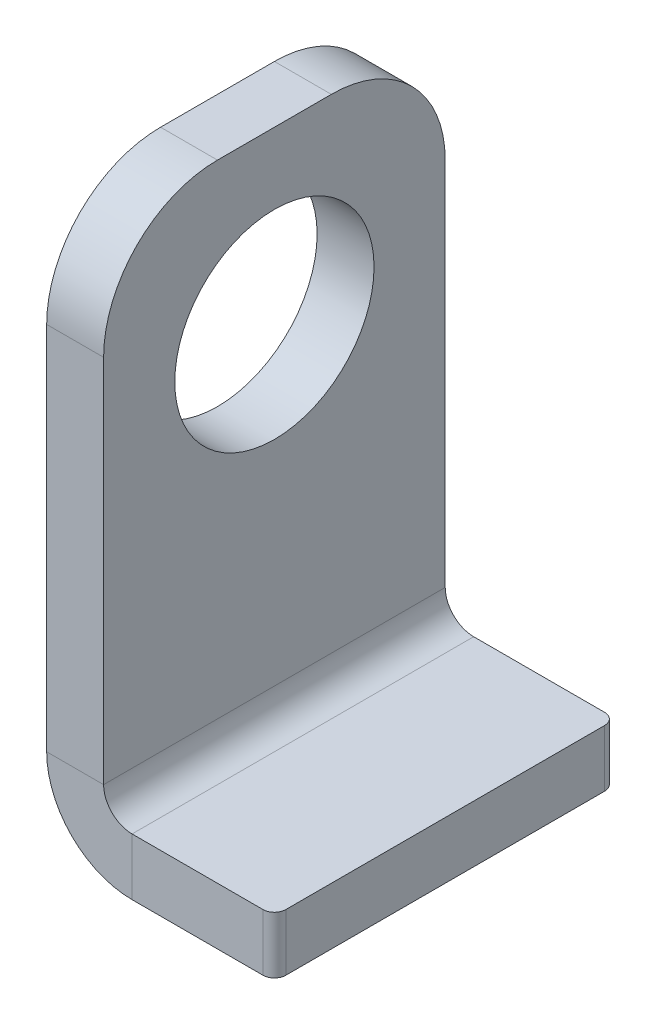
ISO-10303-21;
HEADER;
FILE_DESCRIPTION(('STEP AP214'),'2;1');
FILE_NAME('part.step','',(''),(''),'','','');
FILE_SCHEMA(('AUTOMOTIVE_DESIGN { 1 0 10303 214 1 1 1 1 }'));
ENDSEC;
DATA;
#1=APPLICATION_CONTEXT('core data for automotive mechanical design processes');
#2=APPLICATION_PROTOCOL_DEFINITION('international standard','automotive_design',2000,#1);
#3=PRODUCT_CONTEXT('',#1,'mechanical');
#4=PRODUCT('Part','Part','',(#3));
#5=PRODUCT_RELATED_PRODUCT_CATEGORY('part','',(#4));
#6=PRODUCT_DEFINITION_FORMATION('','',#4);
#7=PRODUCT_DEFINITION_CONTEXT('part definition',#1,'design');
#8=PRODUCT_DEFINITION('design','',#6,#7);
#9=PRODUCT_DEFINITION_SHAPE('','',#8);
#10=(LENGTH_UNIT() NAMED_UNIT(*) SI_UNIT(.MILLI.,.METRE.));
#11=(NAMED_UNIT(*) PLANE_ANGLE_UNIT() SI_UNIT($,.RADIAN.));
#12=(NAMED_UNIT(*) SI_UNIT($,.STERADIAN.) SOLID_ANGLE_UNIT());
#13=UNCERTAINTY_MEASURE_WITH_UNIT(LENGTH_MEASURE(1.E-05),#10,'distance_accuracy_value','');
#14=(GEOMETRIC_REPRESENTATION_CONTEXT(3) GLOBAL_UNCERTAINTY_ASSIGNED_CONTEXT((#13)) GLOBAL_UNIT_ASSIGNED_CONTEXT((#10,
#11,#12)) REPRESENTATION_CONTEXT('',''));
#15=CARTESIAN_POINT('',(0.,0.,0.));
#16=DIRECTION('',(0.,0.,1.));
#17=DIRECTION('',(1.,0.,0.));
#18=AXIS2_PLACEMENT_3D('',#15,#16,#17);
#19=CARTESIAN_POINT('',(0.,-85.,60.));
#20=DIRECTION('',(0.,0.,1.));
#21=DIRECTION('',(1.,0.,0.));
#22=AXIS2_PLACEMENT_3D('',#19,#20,#21);
#23=PLANE('',#22);
#24=DIRECTION('',(1.,0.,0.));
#25=VECTOR('',#24,1.);
#26=CARTESIAN_POINT('',(0.,-85.,60.));
#27=LINE('',#26,#25);
#28=CARTESIAN_POINT('',(0.,-85.,60.));
#29=VERTEX_POINT('',#28);
#30=CARTESIAN_POINT('',(10.,-85.,60.));
#31=VERTEX_POINT('',#30);
#32=EDGE_CURVE('E147',#29,#31,#27,.T.);
#33=ORIENTED_EDGE('',*,*,#32,.F.);
#34=CARTESIAN_POINT('',(15.,-85.,60.));
#35=DIRECTION('',(0.,0.,-1.));
#36=DIRECTION('',(-1.,0.,0.));
#37=AXIS2_PLACEMENT_3D('',#34,#35,#36);
#38=CIRCLE('',#37,15.);
#39=CARTESIAN_POINT('',(15.,-100.,60.));
#40=VERTEX_POINT('',#39);
#41=EDGE_CURVE('E144',#29,#40,#38,.F.);
#42=ORIENTED_EDGE('',*,*,#41,.T.);
#43=DIRECTION('',(0.,-1.,0.));
#44=VECTOR('',#43,1.);
#45=CARTESIAN_POINT('',(15.,-90.,60.));
#46=LINE('',#45,#44);
#47=CARTESIAN_POINT('',(15.,-90.,60.));
#48=VERTEX_POINT('',#47);
#49=EDGE_CURVE('E138',#48,#40,#46,.T.);
#50=ORIENTED_EDGE('',*,*,#49,.F.);
#51=CARTESIAN_POINT('',(15.,-85.,60.));
#52=DIRECTION('',(0.,0.,1.));
#53=DIRECTION('',(1.,0.,0.));
#54=AXIS2_PLACEMENT_3D('',#51,#52,#53);
#55=CIRCLE('',#54,5.);
#56=EDGE_CURVE('E142',#31,#48,#55,.T.);
#57=ORIENTED_EDGE('',*,*,#56,.F.);
#58=EDGE_LOOP('',(#33,#42,#50,#57));
#59=FACE_BOUND('',#58,.T.);
#60=ADVANCED_FACE('F44',(#59),#23,.T.);
#61=CARTESIAN_POINT('',(15.,-90.,60.));
#62=DIRECTION('',(0.,0.,1.));
#63=DIRECTION('',(1.,0.,0.));
#64=AXIS2_PLACEMENT_3D('',#61,#62,#63);
#65=PLANE('',#64);
#66=DIRECTION('',(0.,-1.,0.));
#67=VECTOR('',#66,1.);
#68=CARTESIAN_POINT('',(10.,0.,60.));
#69=LINE('',#68,#67);
#70=CARTESIAN_POINT('',(10.,-20.,60.));
#71=VERTEX_POINT('',#70);
#72=EDGE_CURVE('E171',#71,#31,#69,.T.);
#73=ORIENTED_EDGE('',*,*,#72,.F.);
#74=DIRECTION('',(1.,0.,0.));
#75=VECTOR('',#74,1.);
#76=CARTESIAN_POINT('',(15.,-20.,60.));
#77=LINE('',#76,#75);
#78=CARTESIAN_POINT('',(0.,-20.,60.));
#79=VERTEX_POINT('',#78);
#80=EDGE_CURVE('E249',#71,#79,#77,.F.);
#81=ORIENTED_EDGE('',*,*,#80,.T.);
#82=DIRECTION('',(0.,-1.,0.));
#83=VECTOR('',#82,1.);
#84=CARTESIAN_POINT('',(0.,0.,60.));
#85=LINE('',#84,#83);
#86=EDGE_CURVE('E175',#79,#29,#85,.T.);
#87=ORIENTED_EDGE('',*,*,#86,.T.);
#88=ORIENTED_EDGE('',*,*,#32,.T.);
#89=EDGE_LOOP('',(#73,#81,#87,#88));
#90=FACE_BOUND('',#89,.T.);
#91=ADVANCED_FACE('F352',(#90),#65,.T.);
#92=CARTESIAN_POINT('',(15.,-100.,0.));
#93=DIRECTION('',(0.,0.,-1.));
#94=DIRECTION('',(-1.,0.,0.));
#95=AXIS2_PLACEMENT_3D('',#92,#93,#94);
#96=PLANE('',#95);
#97=DIRECTION('',(0.,1.,0.));
#98=VECTOR('',#97,1.);
#99=CARTESIAN_POINT('',(15.,-100.,0.));
#100=LINE('',#99,#98);
#101=CARTESIAN_POINT('',(15.,-100.,0.));
#102=VERTEX_POINT('',#101);
#103=CARTESIAN_POINT('',(15.,-90.,0.));
#104=VERTEX_POINT('',#103);
#105=EDGE_CURVE('E148',#102,#104,#100,.T.);
#106=ORIENTED_EDGE('',*,*,#105,.F.);
#107=CARTESIAN_POINT('',(15.,-85.,0.));
#108=DIRECTION('',(0.,0.,-1.));
#109=DIRECTION('',(-1.,0.,0.));
#110=AXIS2_PLACEMENT_3D('',#107,#108,#109);
#111=CIRCLE('',#110,15.);
#112=CARTESIAN_POINT('',(0.,-85.,0.));
#113=VERTEX_POINT('',#112);
#114=EDGE_CURVE('E200',#113,#102,#111,.F.);
#115=ORIENTED_EDGE('',*,*,#114,.F.);
#116=DIRECTION('',(-1.,0.,0.));
#117=VECTOR('',#116,1.);
#118=CARTESIAN_POINT('',(10.,-85.,0.));
#119=LINE('',#118,#117);
#120=CARTESIAN_POINT('',(10.,-85.,0.));
#121=VERTEX_POINT('',#120);
#122=EDGE_CURVE('E227',#121,#113,#119,.T.);
#123=ORIENTED_EDGE('',*,*,#122,.F.);
#124=CARTESIAN_POINT('',(15.,-85.,0.));
#125=DIRECTION('',(0.,0.,1.));
#126=DIRECTION('',(1.,0.,0.));
#127=AXIS2_PLACEMENT_3D('',#124,#125,#126);
#128=CIRCLE('',#127,5.);
#129=EDGE_CURVE('E191',#121,#104,#128,.T.);
#130=ORIENTED_EDGE('',*,*,#129,.T.);
#131=EDGE_LOOP('',(#106,#115,#123,#130));
#132=FACE_BOUND('',#131,.T.);
#133=ADVANCED_FACE('F338',(#132),#96,.T.);
#134=CARTESIAN_POINT('',(10.,-85.,0.));
#135=DIRECTION('',(0.,0.,-1.));
#136=DIRECTION('',(-1.,0.,0.));
#137=AXIS2_PLACEMENT_3D('',#134,#135,#136);
#138=PLANE('',#137);
#139=DIRECTION('',(1.,0.,0.));
#140=VECTOR('',#139,1.);
#141=CARTESIAN_POINT('',(0.,-90.,0.));
#142=LINE('',#141,#140);
#143=CARTESIAN_POINT('',(38.,-90.,0.));
#144=VERTEX_POINT('',#143);
#145=EDGE_CURVE('E155',#104,#144,#142,.T.);
#146=ORIENTED_EDGE('',*,*,#145,.T.);
#147=DIRECTION('',(0.,-1.,0.));
#148=VECTOR('',#147,1.);
#149=CARTESIAN_POINT('',(38.,-85.,0.));
#150=LINE('',#149,#148);
#151=CARTESIAN_POINT('',(38.,-100.,0.));
#152=VERTEX_POINT('',#151);
#153=EDGE_CURVE('E11',#144,#152,#150,.T.);
#154=ORIENTED_EDGE('',*,*,#153,.T.);
#155=DIRECTION('',(1.,0.,0.));
#156=VECTOR('',#155,1.);
#157=CARTESIAN_POINT('',(0.,-100.,0.));
#158=LINE('',#157,#156);
#159=EDGE_CURVE('E184',#102,#152,#158,.T.);
#160=ORIENTED_EDGE('',*,*,#159,.F.);
#161=ORIENTED_EDGE('',*,*,#105,.T.);
#162=EDGE_LOOP('',(#146,#154,#160,#161));
#163=FACE_BOUND('',#162,.T.);
#164=ADVANCED_FACE('F341',(#163),#138,.T.);
#165=CARTESIAN_POINT('',(0.,-100.,60.));
#166=DIRECTION('',(0.,1.,0.));
#167=DIRECTION('',(0.,0.,1.));
#168=AXIS2_PLACEMENT_3D('',#165,#166,#167);
#169=PLANE('',#168);
#170=DIRECTION('',(0.,0.,-1.));
#171=VECTOR('',#170,1.);
#172=CARTESIAN_POINT('',(40.,-100.,60.));
#173=LINE('',#172,#171);
#174=CARTESIAN_POINT('',(40.,-100.,58.));
#175=VERTEX_POINT('',#174);
#176=CARTESIAN_POINT('',(40.,-100.,2.));
#177=VERTEX_POINT('',#176);
#178=EDGE_CURVE('E223',#175,#177,#173,.T.);
#179=ORIENTED_EDGE('',*,*,#178,.F.);
#180=CARTESIAN_POINT('',(38.,-100.,58.));
#181=DIRECTION('',(0.,1.,0.));
#182=DIRECTION('',(0.,0.,1.));
#183=AXIS2_PLACEMENT_3D('',#180,#181,#182);
#184=CIRCLE('',#183,2.);
#185=CARTESIAN_POINT('',(38.,-100.,60.));
#186=VERTEX_POINT('',#185);
#187=EDGE_CURVE('E272',#175,#186,#184,.F.);
#188=ORIENTED_EDGE('',*,*,#187,.T.);
#189=DIRECTION('',(1.,0.,0.));
#190=VECTOR('',#189,1.);
#191=CARTESIAN_POINT('',(0.,-100.,60.));
#192=LINE('',#191,#190);
#193=EDGE_CURVE('E165',#40,#186,#192,.T.);
#194=ORIENTED_EDGE('',*,*,#193,.F.);
#195=DIRECTION('',(0.,0.,-1.));
#196=VECTOR('',#195,1.);
#197=CARTESIAN_POINT('',(15.,-100.,60.));
#198=LINE('',#197,#196);
#199=EDGE_CURVE('E183',#40,#102,#198,.T.);
#200=ORIENTED_EDGE('',*,*,#199,.T.);
#201=ORIENTED_EDGE('',*,*,#159,.T.);
#202=CARTESIAN_POINT('',(38.,-100.,2.));
#203=DIRECTION('',(0.,1.,0.));
#204=DIRECTION('',(0.,0.,1.));
#205=AXIS2_PLACEMENT_3D('',#202,#203,#204);
#206=CIRCLE('',#205,2.);
#207=EDGE_CURVE('E269',#152,#177,#206,.F.);
#208=ORIENTED_EDGE('',*,*,#207,.T.);
#209=EDGE_LOOP('',(#179,#188,#194,#200,#201,#208));
#210=FACE_BOUND('',#209,.T.);
#211=ADVANCED_FACE('F290',(#210),#169,.F.);
#212=CARTESIAN_POINT('',(40.,-90.,60.));
#213=DIRECTION('',(1.,0.,0.));
#214=DIRECTION('',(0.,0.,-1.));
#215=AXIS2_PLACEMENT_3D('',#212,#213,#214);
#216=PLANE('',#215);
#217=DIRECTION('',(0.,0.,-1.));
#218=VECTOR('',#217,1.);
#219=CARTESIAN_POINT('',(40.,-90.,60.));
#220=LINE('',#219,#218);
#221=CARTESIAN_POINT('',(40.,-90.,58.));
#222=VERTEX_POINT('',#221);
#223=CARTESIAN_POINT('',(40.,-90.,2.));
#224=VERTEX_POINT('',#223);
#225=EDGE_CURVE('E160',#222,#224,#220,.T.);
#226=ORIENTED_EDGE('',*,*,#225,.F.);
#227=DIRECTION('',(0.,-1.,0.));
#228=VECTOR('',#227,1.);
#229=CARTESIAN_POINT('',(40.,-90.,58.));
#230=LINE('',#229,#228);
#231=EDGE_CURVE('E265',#222,#175,#230,.T.);
#232=ORIENTED_EDGE('',*,*,#231,.T.);
#233=ORIENTED_EDGE('',*,*,#178,.T.);
#234=DIRECTION('',(0.,-1.,0.));
#235=VECTOR('',#234,1.);
#236=CARTESIAN_POINT('',(40.,-90.,2.));
#237=LINE('',#236,#235);
#238=EDGE_CURVE('E262',#177,#224,#237,.F.);
#239=ORIENTED_EDGE('',*,*,#238,.T.);
#240=EDGE_LOOP('',(#226,#232,#233,#239));
#241=FACE_BOUND('',#240,.T.);
#242=ADVANCED_FACE('F284',(#241),#216,.T.);
#243=CARTESIAN_POINT('',(0.,-90.,60.));
#244=DIRECTION('',(0.,1.,0.));
#245=DIRECTION('',(0.,0.,1.));
#246=AXIS2_PLACEMENT_3D('',#243,#244,#245);
#247=PLANE('',#246);
#248=DIRECTION('',(1.,0.,0.));
#249=VECTOR('',#248,1.);
#250=CARTESIAN_POINT('',(0.,-90.,60.));
#251=LINE('',#250,#249);
#252=CARTESIAN_POINT('',(38.,-90.,60.));
#253=VERTEX_POINT('',#252);
#254=EDGE_CURVE('E153',#48,#253,#251,.T.);
#255=ORIENTED_EDGE('',*,*,#254,.T.);
#256=CARTESIAN_POINT('',(38.,-90.,58.));
#257=DIRECTION('',(0.,1.,0.));
#258=DIRECTION('',(0.,0.,1.));
#259=AXIS2_PLACEMENT_3D('',#256,#257,#258);
#260=CIRCLE('',#259,2.);
#261=EDGE_CURVE('E53',#253,#222,#260,.T.);
#262=ORIENTED_EDGE('',*,*,#261,.T.);
#263=ORIENTED_EDGE('',*,*,#225,.T.);
#264=CARTESIAN_POINT('',(38.,-90.,2.));
#265=DIRECTION('',(0.,1.,0.));
#266=DIRECTION('',(0.,0.,1.));
#267=AXIS2_PLACEMENT_3D('',#264,#265,#266);
#268=CIRCLE('',#267,2.);
#269=EDGE_CURVE('E60',#224,#144,#268,.T.);
#270=ORIENTED_EDGE('',*,*,#269,.T.);
#271=ORIENTED_EDGE('',*,*,#145,.F.);
#272=DIRECTION('',(0.,0.,-1.));
#273=VECTOR('',#272,1.);
#274=CARTESIAN_POINT('',(15.,-90.,60.));
#275=LINE('',#274,#273);
#276=EDGE_CURVE('E151',#48,#104,#275,.T.);
#277=ORIENTED_EDGE('',*,*,#276,.F.);
#278=EDGE_LOOP('',(#255,#262,#263,#270,#271,#277));
#279=FACE_BOUND('',#278,.T.);
#280=ADVANCED_FACE('F152',(#279),#247,.T.);
#281=CARTESIAN_POINT('',(15.,-85.,60.));
#282=DIRECTION('',(0.,0.,-1.));
#283=DIRECTION('',(-1.,0.,0.));
#284=AXIS2_PLACEMENT_3D('',#281,#282,#283);
#285=CYLINDRICAL_SURFACE('',#284,5.);
#286=ORIENTED_EDGE('',*,*,#129,.F.);
#287=DIRECTION('',(0.,0.,-1.));
#288=VECTOR('',#287,1.);
#289=CARTESIAN_POINT('',(10.,-85.,60.));
#290=LINE('',#289,#288);
#291=EDGE_CURVE('E161',#31,#121,#290,.T.);
#292=ORIENTED_EDGE('',*,*,#291,.F.);
#293=ORIENTED_EDGE('',*,*,#56,.T.);
#294=ORIENTED_EDGE('',*,*,#276,.T.);
#295=EDGE_LOOP('',(#286,#292,#293,#294));
#296=FACE_BOUND('',#295,.T.);
#297=ADVANCED_FACE('F168',(#296),#285,.F.);
#298=CARTESIAN_POINT('',(10.,0.,60.));
#299=DIRECTION('',(1.,0.,0.));
#300=DIRECTION('',(0.,1.,0.));
#301=AXIS2_PLACEMENT_3D('',#298,#299,#300);
#302=PLANE('',#301);
#303=CARTESIAN_POINT('',(10.,-30.,30.));
#304=DIRECTION('',(1.,0.,0.));
#305=DIRECTION('',(0.,1.,0.));
#306=AXIS2_PLACEMENT_3D('',#303,#304,#305);
#307=CIRCLE('',#306,17.5);
#308=CARTESIAN_POINT('',(10.,-12.5,30.));
#309=VERTEX_POINT('',#308);
#310=EDGE_CURVE('E188',#309,#309,#307,.T.);
#311=ORIENTED_EDGE('',*,*,#310,.F.);
#312=EDGE_LOOP('',(#311));
#313=FACE_BOUND('',#312,.T.);
#314=DIRECTION('',(0.,0.,-1.));
#315=VECTOR('',#314,1.);
#316=CARTESIAN_POINT('',(10.,0.,60.));
#317=LINE('',#316,#315);
#318=CARTESIAN_POINT('',(10.,0.,40.));
#319=VERTEX_POINT('',#318);
#320=CARTESIAN_POINT('',(10.,0.,20.));
#321=VERTEX_POINT('',#320);
#322=EDGE_CURVE('E215',#319,#321,#317,.T.);
#323=ORIENTED_EDGE('',*,*,#322,.F.);
#324=CARTESIAN_POINT('',(10.,-20.,40.));
#325=DIRECTION('',(1.,0.,0.));
#326=DIRECTION('',(0.,1.,0.));
#327=AXIS2_PLACEMENT_3D('',#324,#325,#326);
#328=CIRCLE('',#327,20.);
#329=EDGE_CURVE('E246',#319,#71,#328,.T.);
#330=ORIENTED_EDGE('',*,*,#329,.T.);
#331=ORIENTED_EDGE('',*,*,#72,.T.);
#332=ORIENTED_EDGE('',*,*,#291,.T.);
#333=DIRECTION('',(0.,-1.,0.));
#334=VECTOR('',#333,1.);
#335=CARTESIAN_POINT('',(10.,0.,0.));
#336=LINE('',#335,#334);
#337=CARTESIAN_POINT('',(10.,-20.,0.));
#338=VERTEX_POINT('',#337);
#339=EDGE_CURVE('E194',#338,#121,#336,.T.);
#340=ORIENTED_EDGE('',*,*,#339,.F.);
#341=CARTESIAN_POINT('',(10.,-20.,20.));
#342=DIRECTION('',(1.,0.,0.));
#343=DIRECTION('',(0.,1.,0.));
#344=AXIS2_PLACEMENT_3D('',#341,#342,#343);
#345=CIRCLE('',#344,20.);
#346=EDGE_CURVE('E243',#338,#321,#345,.T.);
#347=ORIENTED_EDGE('',*,*,#346,.T.);
#348=EDGE_LOOP('',(#323,#330,#331,#332,#340,#347));
#349=FACE_BOUND('',#348,.T.);
#350=ADVANCED_FACE('F324',(#313,#349),#302,.T.);
#351=CARTESIAN_POINT('',(0.,0.,60.));
#352=DIRECTION('',(0.,1.,0.));
#353=DIRECTION('',(-1.,0.,0.));
#354=AXIS2_PLACEMENT_3D('',#351,#352,#353);
#355=PLANE('',#354);
#356=DIRECTION('',(0.,0.,-1.));
#357=VECTOR('',#356,1.);
#358=CARTESIAN_POINT('',(0.,0.,60.));
#359=LINE('',#358,#357);
#360=CARTESIAN_POINT('',(0.,0.,40.));
#361=VERTEX_POINT('',#360);
#362=CARTESIAN_POINT('',(0.,0.,20.));
#363=VERTEX_POINT('',#362);
#364=EDGE_CURVE('E211',#361,#363,#359,.T.);
#365=ORIENTED_EDGE('',*,*,#364,.F.);
#366=DIRECTION('',(1.,0.,0.));
#367=VECTOR('',#366,1.);
#368=CARTESIAN_POINT('',(0.,0.,40.));
#369=LINE('',#368,#367);
#370=EDGE_CURVE('E239',#361,#319,#369,.T.);
#371=ORIENTED_EDGE('',*,*,#370,.T.);
#372=ORIENTED_EDGE('',*,*,#322,.T.);
#373=DIRECTION('',(1.,0.,0.));
#374=VECTOR('',#373,1.);
#375=CARTESIAN_POINT('',(0.,0.,20.));
#376=LINE('',#375,#374);
#377=EDGE_CURVE('E236',#321,#363,#376,.F.);
#378=ORIENTED_EDGE('',*,*,#377,.T.);
#379=EDGE_LOOP('',(#365,#371,#372,#378));
#380=FACE_BOUND('',#379,.T.);
#381=ADVANCED_FACE('F309',(#380),#355,.T.);
#382=CARTESIAN_POINT('',(0.,0.,60.));
#383=DIRECTION('',(1.,0.,0.));
#384=DIRECTION('',(0.,1.,0.));
#385=AXIS2_PLACEMENT_3D('',#382,#383,#384);
#386=PLANE('',#385);
#387=CARTESIAN_POINT('',(0.,-30.,30.));
#388=DIRECTION('',(-1.,0.,0.));
#389=DIRECTION('',(0.,-1.,0.));
#390=AXIS2_PLACEMENT_3D('',#387,#388,#389);
#391=CIRCLE('',#390,17.5);
#392=CARTESIAN_POINT('',(0.,-47.5,30.));
#393=VERTEX_POINT('',#392);
#394=EDGE_CURVE('E297',#393,#393,#391,.T.);
#395=ORIENTED_EDGE('',*,*,#394,.F.);
#396=EDGE_LOOP('',(#395));
#397=FACE_BOUND('',#396,.T.);
#398=ORIENTED_EDGE('',*,*,#86,.F.);
#399=CARTESIAN_POINT('',(0.,-20.,40.));
#400=DIRECTION('',(1.,0.,0.));
#401=DIRECTION('',(0.,1.,0.));
#402=AXIS2_PLACEMENT_3D('',#399,#400,#401);
#403=CIRCLE('',#402,20.);
#404=EDGE_CURVE('E255',#79,#361,#403,.F.);
#405=ORIENTED_EDGE('',*,*,#404,.T.);
#406=ORIENTED_EDGE('',*,*,#364,.T.);
#407=CARTESIAN_POINT('',(0.,-20.,20.));
#408=DIRECTION('',(1.,0.,0.));
#409=DIRECTION('',(0.,1.,0.));
#410=AXIS2_PLACEMENT_3D('',#407,#408,#409);
#411=CIRCLE('',#410,20.);
#412=CARTESIAN_POINT('',(0.,-20.,0.));
#413=VERTEX_POINT('',#412);
#414=EDGE_CURVE('E252',#363,#413,#411,.F.);
#415=ORIENTED_EDGE('',*,*,#414,.T.);
#416=DIRECTION('',(0.,-1.,0.));
#417=VECTOR('',#416,1.);
#418=CARTESIAN_POINT('',(0.,0.,0.));
#419=LINE('',#418,#417);
#420=EDGE_CURVE('E197',#413,#113,#419,.T.);
#421=ORIENTED_EDGE('',*,*,#420,.T.);
#422=DIRECTION('',(0.,0.,-1.));
#423=VECTOR('',#422,1.);
#424=CARTESIAN_POINT('',(0.,-85.,60.));
#425=LINE('',#424,#423);
#426=EDGE_CURVE('E207',#29,#113,#425,.T.);
#427=ORIENTED_EDGE('',*,*,#426,.F.);
#428=EDGE_LOOP('',(#398,#405,#406,#415,#421,#427));
#429=FACE_BOUND('',#428,.T.);
#430=ADVANCED_FACE('F305',(#397,#429),#386,.F.);
#431=CARTESIAN_POINT('',(15.,-85.,60.));
#432=DIRECTION('',(0.,0.,-1.));
#433=DIRECTION('',(-1.,0.,0.));
#434=AXIS2_PLACEMENT_3D('',#431,#432,#433);
#435=CYLINDRICAL_SURFACE('',#434,15.);
#436=ORIENTED_EDGE('',*,*,#114,.T.);
#437=ORIENTED_EDGE('',*,*,#199,.F.);
#438=ORIENTED_EDGE('',*,*,#41,.F.);
#439=ORIENTED_EDGE('',*,*,#426,.T.);
#440=EDGE_LOOP('',(#436,#437,#438,#439));
#441=FACE_BOUND('',#440,.T.);
#442=ADVANCED_FACE('F308',(#441),#435,.T.);
#443=CARTESIAN_POINT('',(15.,-85.,60.));
#444=DIRECTION('',(0.,0.,1.));
#445=DIRECTION('',(1.,0.,0.));
#446=AXIS2_PLACEMENT_3D('',#443,#444,#445);
#447=PLANE('',#446);
#448=ORIENTED_EDGE('',*,*,#193,.T.);
#449=DIRECTION('',(0.,-1.,0.));
#450=VECTOR('',#449,1.);
#451=CARTESIAN_POINT('',(38.,-85.,60.));
#452=LINE('',#451,#450);
#453=EDGE_CURVE('E68',#186,#253,#452,.F.);
#454=ORIENTED_EDGE('',*,*,#453,.T.);
#455=ORIENTED_EDGE('',*,*,#254,.F.);
#456=ORIENTED_EDGE('',*,*,#49,.T.);
#457=EDGE_LOOP('',(#448,#454,#455,#456));
#458=FACE_BOUND('',#457,.T.);
#459=ADVANCED_FACE('F163',(#458),#447,.T.);
#460=CARTESIAN_POINT('',(15.,-85.,0.));
#461=DIRECTION('',(0.,0.,1.));
#462=DIRECTION('',(1.,0.,0.));
#463=AXIS2_PLACEMENT_3D('',#460,#461,#462);
#464=PLANE('',#463);
#465=ORIENTED_EDGE('',*,*,#420,.F.);
#466=DIRECTION('',(1.,0.,0.));
#467=VECTOR('',#466,1.);
#468=CARTESIAN_POINT('',(10.,-20.,0.));
#469=LINE('',#468,#467);
#470=EDGE_CURVE('E258',#413,#338,#469,.T.);
#471=ORIENTED_EDGE('',*,*,#470,.T.);
#472=ORIENTED_EDGE('',*,*,#339,.T.);
#473=ORIENTED_EDGE('',*,*,#122,.T.);
#474=EDGE_LOOP('',(#465,#471,#472,#473));
#475=FACE_BOUND('',#474,.T.);
#476=ADVANCED_FACE('F333',(#475),#464,.F.);
#477=CARTESIAN_POINT('',(0.,-20.,40.));
#478=DIRECTION('',(1.,0.,0.));
#479=DIRECTION('',(0.,1.,0.));
#480=AXIS2_PLACEMENT_3D('',#477,#478,#479);
#481=CYLINDRICAL_SURFACE('',#480,20.);
#482=ORIENTED_EDGE('',*,*,#404,.F.);
#483=ORIENTED_EDGE('',*,*,#80,.F.);
#484=ORIENTED_EDGE('',*,*,#329,.F.);
#485=ORIENTED_EDGE('',*,*,#370,.F.);
#486=EDGE_LOOP('',(#482,#483,#484,#485));
#487=FACE_BOUND('',#486,.T.);
#488=ADVANCED_FACE('F319',(#487),#481,.T.);
#489=CARTESIAN_POINT('',(15.,-20.,20.));
#490=DIRECTION('',(-1.,0.,0.));
#491=DIRECTION('',(0.,-1.,0.));
#492=AXIS2_PLACEMENT_3D('',#489,#490,#491);
#493=CYLINDRICAL_SURFACE('',#492,20.);
#494=ORIENTED_EDGE('',*,*,#414,.F.);
#495=ORIENTED_EDGE('',*,*,#377,.F.);
#496=ORIENTED_EDGE('',*,*,#346,.F.);
#497=ORIENTED_EDGE('',*,*,#470,.F.);
#498=EDGE_LOOP('',(#494,#495,#496,#497));
#499=FACE_BOUND('',#498,.T.);
#500=ADVANCED_FACE('F330',(#499),#493,.T.);
#501=CARTESIAN_POINT('',(38.,-90.,58.));
#502=DIRECTION('',(0.,-1.,0.));
#503=DIRECTION('',(0.,0.,-1.));
#504=AXIS2_PLACEMENT_3D('',#501,#502,#503);
#505=CYLINDRICAL_SURFACE('',#504,2.);
#506=ORIENTED_EDGE('',*,*,#261,.F.);
#507=ORIENTED_EDGE('',*,*,#453,.F.);
#508=ORIENTED_EDGE('',*,*,#187,.F.);
#509=ORIENTED_EDGE('',*,*,#231,.F.);
#510=EDGE_LOOP('',(#506,#507,#508,#509));
#511=FACE_BOUND('',#510,.T.);
#512=ADVANCED_FACE('F287',(#511),#505,.T.);
#513=CARTESIAN_POINT('',(38.,-85.,2.));
#514=DIRECTION('',(0.,-1.,0.));
#515=DIRECTION('',(0.,0.,-1.));
#516=AXIS2_PLACEMENT_3D('',#513,#514,#515);
#517=CYLINDRICAL_SURFACE('',#516,2.);
#518=ORIENTED_EDGE('',*,*,#269,.F.);
#519=ORIENTED_EDGE('',*,*,#238,.F.);
#520=ORIENTED_EDGE('',*,*,#207,.F.);
#521=ORIENTED_EDGE('',*,*,#153,.F.);
#522=EDGE_LOOP('',(#518,#519,#520,#521));
#523=FACE_BOUND('',#522,.T.);
#524=ADVANCED_FACE('F46',(#523),#517,.T.);
#525=CARTESIAN_POINT('',(30.,-30.,30.));
#526=DIRECTION('',(-1.,0.,0.));
#527=DIRECTION('',(0.,-1.,0.));
#528=AXIS2_PLACEMENT_3D('',#525,#526,#527);
#529=CYLINDRICAL_SURFACE('',#528,17.5);
#530=ORIENTED_EDGE('',*,*,#310,.T.);
#531=EDGE_LOOP('',(#530));
#532=FACE_BOUND('',#531,.T.);
#533=ORIENTED_EDGE('',*,*,#394,.T.);
#534=EDGE_LOOP('',(#533));
#535=FACE_BOUND('',#534,.T.);
#536=ADVANCED_FACE('F303',(#532,#535),#529,.F.);
#537=CLOSED_SHELL('',(#60,#91,#133,#164,#211,#242,#280,#297,#350,#381,#430,#442,#459,#476,#488,
#500,#512,#524,#536));
#538=MANIFOLD_SOLID_BREP('B2',#537);
#539=ADVANCED_BREP_SHAPE_REPRESENTATION('',(#18,#538),#14);
#540=SHAPE_DEFINITION_REPRESENTATION(#9,#539);
ENDSEC;
END-ISO-10303-21;
